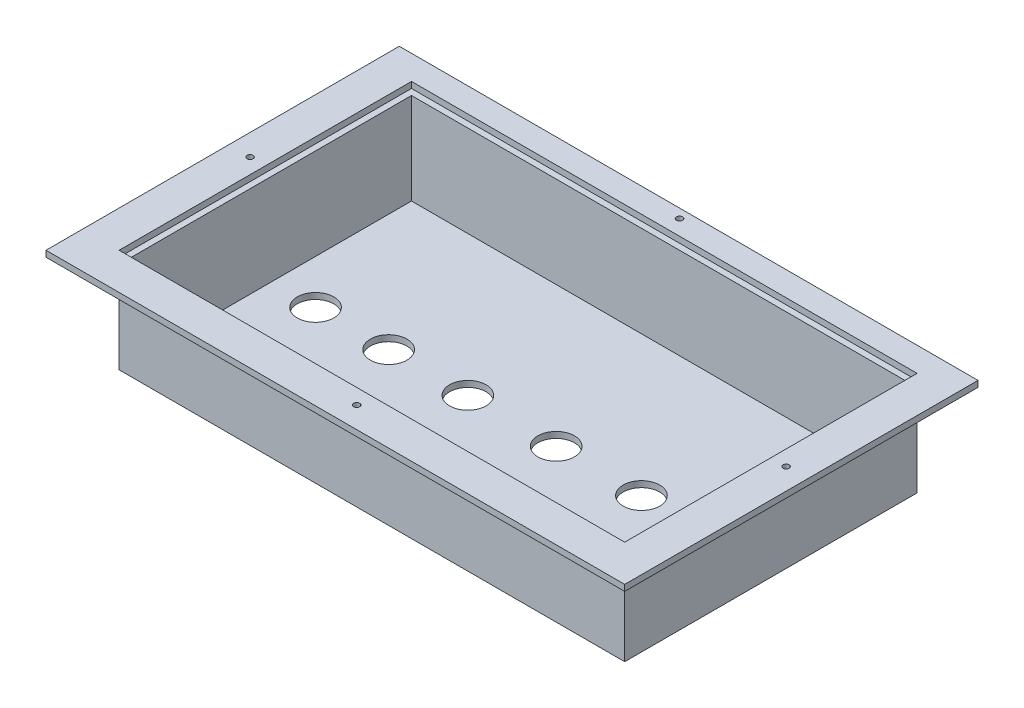
ISO-10303-21;
HEADER;
FILE_DESCRIPTION(('STEP AP214'),'2;1');
FILE_NAME('part.step','',(''),(''),'','','');
FILE_SCHEMA(('AUTOMOTIVE_DESIGN { 1 0 10303 214 1 1 1 1 }'));
ENDSEC;
DATA;
#1=APPLICATION_CONTEXT('core data for automotive mechanical design processes');
#2=APPLICATION_PROTOCOL_DEFINITION('international standard','automotive_design',2000,#1);
#3=PRODUCT_CONTEXT('',#1,'mechanical');
#4=PRODUCT('Part','Part','',(#3));
#5=PRODUCT_RELATED_PRODUCT_CATEGORY('part','',(#4));
#6=PRODUCT_DEFINITION_FORMATION('','',#4);
#7=PRODUCT_DEFINITION_CONTEXT('part definition',#1,'design');
#8=PRODUCT_DEFINITION('design','',#6,#7);
#9=PRODUCT_DEFINITION_SHAPE('','',#8);
#10=(LENGTH_UNIT() NAMED_UNIT(*) SI_UNIT(.MILLI.,.METRE.));
#11=(NAMED_UNIT(*) PLANE_ANGLE_UNIT() SI_UNIT($,.RADIAN.));
#12=(NAMED_UNIT(*) SI_UNIT($,.STERADIAN.) SOLID_ANGLE_UNIT());
#13=UNCERTAINTY_MEASURE_WITH_UNIT(LENGTH_MEASURE(1.E-05),#10,'distance_accuracy_value','');
#14=(GEOMETRIC_REPRESENTATION_CONTEXT(3) GLOBAL_UNCERTAINTY_ASSIGNED_CONTEXT((#13)) GLOBAL_UNIT_ASSIGNED_CONTEXT((#10,
#11,#12)) REPRESENTATION_CONTEXT('',''));
#15=CARTESIAN_POINT('',(0.,0.,0.));
#16=DIRECTION('',(0.,0.,1.));
#17=DIRECTION('',(1.,0.,0.));
#18=AXIS2_PLACEMENT_3D('',#15,#16,#17);
#19=CARTESIAN_POINT('',(83.,34.,0.));
#20=DIRECTION('',(-1.,0.,0.));
#21=DIRECTION('',(0.,0.,1.));
#22=AXIS2_PLACEMENT_3D('',#19,#20,#21);
#23=PLANE('',#22);
#24=DIRECTION('',(0.,0.,-1.));
#25=VECTOR('',#24,1.);
#26=CARTESIAN_POINT('',(83.,32.,0.));
#27=LINE('',#26,#25);
#28=CARTESIAN_POINT('',(83.,32.,48.));
#29=VERTEX_POINT('',#28);
#30=CARTESIAN_POINT('',(83.,32.,-48.));
#31=VERTEX_POINT('',#30);
#32=EDGE_CURVE('E286',#29,#31,#27,.T.);
#33=ORIENTED_EDGE('',*,*,#32,.F.);
#34=DIRECTION('',(0.,-1.,0.));
#35=VECTOR('',#34,1.);
#36=CARTESIAN_POINT('',(83.,34.,48.));
#37=LINE('',#36,#35);
#38=CARTESIAN_POINT('',(83.,34.,48.));
#39=VERTEX_POINT('',#38);
#40=EDGE_CURVE('E13',#39,#29,#37,.T.);
#41=ORIENTED_EDGE('',*,*,#40,.F.);
#42=DIRECTION('',(0.,0.,-1.));
#43=VECTOR('',#42,1.);
#44=CARTESIAN_POINT('',(83.,34.,0.));
#45=LINE('',#44,#43);
#46=CARTESIAN_POINT('',(83.,34.,-48.));
#47=VERTEX_POINT('',#46);
#48=EDGE_CURVE('E253',#39,#47,#45,.T.);
#49=ORIENTED_EDGE('',*,*,#48,.T.);
#50=DIRECTION('',(0.,-1.,0.));
#51=VECTOR('',#50,1.);
#52=CARTESIAN_POINT('',(83.,34.,-48.));
#53=LINE('',#52,#51);
#54=EDGE_CURVE('E185',#47,#31,#53,.T.);
#55=ORIENTED_EDGE('',*,*,#54,.T.);
#56=EDGE_LOOP('',(#33,#41,#49,#55));
#57=FACE_BOUND('',#56,.T.);
#58=ADVANCED_FACE('F166',(#57),#23,.T.);
#59=CARTESIAN_POINT('',(0.,34.,48.));
#60=DIRECTION('',(0.,0.,-1.));
#61=DIRECTION('',(-1.,0.,0.));
#62=AXIS2_PLACEMENT_3D('',#59,#60,#61);
#63=PLANE('',#62);
#64=DIRECTION('',(1.,0.,0.));
#65=VECTOR('',#64,1.);
#66=CARTESIAN_POINT('',(0.,32.,48.));
#67=LINE('',#66,#65);
#68=CARTESIAN_POINT('',(-83.,32.,48.));
#69=VERTEX_POINT('',#68);
#70=EDGE_CURVE('E242',#69,#29,#67,.T.);
#71=ORIENTED_EDGE('',*,*,#70,.F.);
#72=DIRECTION('',(0.,-1.,0.));
#73=VECTOR('',#72,1.);
#74=CARTESIAN_POINT('',(-83.,34.,48.));
#75=LINE('',#74,#73);
#76=CARTESIAN_POINT('',(-83.,34.,48.));
#77=VERTEX_POINT('',#76);
#78=EDGE_CURVE('E176',#77,#69,#75,.T.);
#79=ORIENTED_EDGE('',*,*,#78,.F.);
#80=DIRECTION('',(1.,0.,0.));
#81=VECTOR('',#80,1.);
#82=CARTESIAN_POINT('',(0.,34.,48.));
#83=LINE('',#82,#81);
#84=EDGE_CURVE('E240',#77,#39,#83,.T.);
#85=ORIENTED_EDGE('',*,*,#84,.T.);
#86=ORIENTED_EDGE('',*,*,#40,.T.);
#87=EDGE_LOOP('',(#71,#79,#85,#86));
#88=FACE_BOUND('',#87,.T.);
#89=ADVANCED_FACE('F239',(#88),#63,.T.);
#90=CARTESIAN_POINT('',(-83.,34.,0.));
#91=DIRECTION('',(1.,0.,0.));
#92=DIRECTION('',(0.,0.,-1.));
#93=AXIS2_PLACEMENT_3D('',#90,#91,#92);
#94=PLANE('',#93);
#95=DIRECTION('',(0.,0.,1.));
#96=VECTOR('',#95,1.);
#97=CARTESIAN_POINT('',(-83.,32.,0.));
#98=LINE('',#97,#96);
#99=CARTESIAN_POINT('',(-83.,32.,-48.));
#100=VERTEX_POINT('',#99);
#101=EDGE_CURVE('E289',#100,#69,#98,.T.);
#102=ORIENTED_EDGE('',*,*,#101,.F.);
#103=DIRECTION('',(0.,-1.,0.));
#104=VECTOR('',#103,1.);
#105=CARTESIAN_POINT('',(-83.,34.,-48.));
#106=LINE('',#105,#104);
#107=CARTESIAN_POINT('',(-83.,34.,-48.));
#108=VERTEX_POINT('',#107);
#109=EDGE_CURVE('E210',#108,#100,#106,.T.);
#110=ORIENTED_EDGE('',*,*,#109,.F.);
#111=DIRECTION('',(0.,0.,1.));
#112=VECTOR('',#111,1.);
#113=CARTESIAN_POINT('',(-83.,34.,0.));
#114=LINE('',#113,#112);
#115=EDGE_CURVE('E252',#108,#77,#114,.T.);
#116=ORIENTED_EDGE('',*,*,#115,.T.);
#117=ORIENTED_EDGE('',*,*,#78,.T.);
#118=EDGE_LOOP('',(#102,#110,#116,#117));
#119=FACE_BOUND('',#118,.T.);
#120=ADVANCED_FACE('F255',(#119),#94,.T.);
#121=CARTESIAN_POINT('',(95.,34.,0.));
#122=DIRECTION('',(1.,0.,0.));
#123=DIRECTION('',(0.,0.,-1.));
#124=AXIS2_PLACEMENT_3D('',#121,#122,#123);
#125=PLANE('',#124);
#126=DIRECTION('',(0.,0.,1.));
#127=VECTOR('',#126,1.);
#128=CARTESIAN_POINT('',(95.,32.,0.));
#129=LINE('',#128,#127);
#130=CARTESIAN_POINT('',(95.,32.,-56.));
#131=VERTEX_POINT('',#130);
#132=CARTESIAN_POINT('',(95.,32.,60.));
#133=VERTEX_POINT('',#132);
#134=EDGE_CURVE('E274',#131,#133,#129,.T.);
#135=ORIENTED_EDGE('',*,*,#134,.F.);
#136=DIRECTION('',(0.,-1.,0.));
#137=VECTOR('',#136,1.);
#138=CARTESIAN_POINT('',(95.,34.,-56.));
#139=LINE('',#138,#137);
#140=CARTESIAN_POINT('',(95.,34.,-56.));
#141=VERTEX_POINT('',#140);
#142=EDGE_CURVE('E170',#141,#131,#139,.T.);
#143=ORIENTED_EDGE('',*,*,#142,.F.);
#144=DIRECTION('',(0.,0.,1.));
#145=VECTOR('',#144,1.);
#146=CARTESIAN_POINT('',(95.,34.,0.));
#147=LINE('',#146,#145);
#148=CARTESIAN_POINT('',(95.,34.,60.));
#149=VERTEX_POINT('',#148);
#150=EDGE_CURVE('E325',#141,#149,#147,.T.);
#151=ORIENTED_EDGE('',*,*,#150,.T.);
#152=DIRECTION('',(0.,-1.,0.));
#153=VECTOR('',#152,1.);
#154=CARTESIAN_POINT('',(95.,34.,60.));
#155=LINE('',#154,#153);
#156=EDGE_CURVE('E258',#149,#133,#155,.T.);
#157=ORIENTED_EDGE('',*,*,#156,.T.);
#158=EDGE_LOOP('',(#135,#143,#151,#157));
#159=FACE_BOUND('',#158,.T.);
#160=ADVANCED_FACE('F310',(#159),#125,.T.);
#161=CARTESIAN_POINT('',(0.,34.,-56.));
#162=DIRECTION('',(0.,0.,-1.));
#163=DIRECTION('',(-1.,0.,0.));
#164=AXIS2_PLACEMENT_3D('',#161,#162,#163);
#165=PLANE('',#164);
#166=DIRECTION('',(1.,0.,0.));
#167=VECTOR('',#166,1.);
#168=CARTESIAN_POINT('',(0.,32.,-56.));
#169=LINE('',#168,#167);
#170=CARTESIAN_POINT('',(-95.,32.,-56.));
#171=VERTEX_POINT('',#170);
#172=EDGE_CURVE('E277',#171,#131,#169,.T.);
#173=ORIENTED_EDGE('',*,*,#172,.F.);
#174=DIRECTION('',(0.,-1.,0.));
#175=VECTOR('',#174,1.);
#176=CARTESIAN_POINT('',(-95.,34.,-56.));
#177=LINE('',#176,#175);
#178=CARTESIAN_POINT('',(-95.,34.,-56.));
#179=VERTEX_POINT('',#178);
#180=EDGE_CURVE('E300',#179,#171,#177,.T.);
#181=ORIENTED_EDGE('',*,*,#180,.F.);
#182=DIRECTION('',(1.,0.,0.));
#183=VECTOR('',#182,1.);
#184=CARTESIAN_POINT('',(0.,34.,-56.));
#185=LINE('',#184,#183);
#186=EDGE_CURVE('E309',#179,#141,#185,.T.);
#187=ORIENTED_EDGE('',*,*,#186,.T.);
#188=ORIENTED_EDGE('',*,*,#142,.T.);
#189=EDGE_LOOP('',(#173,#181,#187,#188));
#190=FACE_BOUND('',#189,.T.);
#191=ADVANCED_FACE('F307',(#190),#165,.T.);
#192=CARTESIAN_POINT('',(-95.,34.,0.));
#193=DIRECTION('',(1.,0.,0.));
#194=DIRECTION('',(0.,0.,-1.));
#195=AXIS2_PLACEMENT_3D('',#192,#193,#194);
#196=PLANE('',#195);
#197=DIRECTION('',(0.,0.,1.));
#198=VECTOR('',#197,1.);
#199=CARTESIAN_POINT('',(-95.,32.,0.));
#200=LINE('',#199,#198);
#201=CARTESIAN_POINT('',(-95.,32.,60.));
#202=VERTEX_POINT('',#201);
#203=EDGE_CURVE('E280',#171,#202,#200,.T.);
#204=ORIENTED_EDGE('',*,*,#203,.T.);
#205=DIRECTION('',(0.,-1.,0.));
#206=VECTOR('',#205,1.);
#207=CARTESIAN_POINT('',(-95.,34.,60.));
#208=LINE('',#207,#206);
#209=CARTESIAN_POINT('',(-95.,34.,60.));
#210=VERTEX_POINT('',#209);
#211=EDGE_CURVE('E298',#210,#202,#208,.T.);
#212=ORIENTED_EDGE('',*,*,#211,.F.);
#213=DIRECTION('',(0.,0.,1.));
#214=VECTOR('',#213,1.);
#215=CARTESIAN_POINT('',(-95.,34.,0.));
#216=LINE('',#215,#214);
#217=EDGE_CURVE('E318',#179,#210,#216,.T.);
#218=ORIENTED_EDGE('',*,*,#217,.F.);
#219=ORIENTED_EDGE('',*,*,#180,.T.);
#220=EDGE_LOOP('',(#204,#212,#218,#219));
#221=FACE_BOUND('',#220,.T.);
#222=ADVANCED_FACE('F316',(#221),#196,.F.);
#223=CARTESIAN_POINT('',(0.,34.,60.));
#224=DIRECTION('',(0.,0.,-1.));
#225=DIRECTION('',(-1.,0.,0.));
#226=AXIS2_PLACEMENT_3D('',#223,#224,#225);
#227=PLANE('',#226);
#228=DIRECTION('',(1.,0.,0.));
#229=VECTOR('',#228,1.);
#230=CARTESIAN_POINT('',(0.,32.,60.));
#231=LINE('',#230,#229);
#232=EDGE_CURVE('E283',#202,#133,#231,.T.);
#233=ORIENTED_EDGE('',*,*,#232,.T.);
#234=ORIENTED_EDGE('',*,*,#156,.F.);
#235=DIRECTION('',(1.,0.,0.));
#236=VECTOR('',#235,1.);
#237=CARTESIAN_POINT('',(0.,34.,60.));
#238=LINE('',#237,#236);
#239=EDGE_CURVE('E321',#210,#149,#238,.T.);
#240=ORIENTED_EDGE('',*,*,#239,.F.);
#241=ORIENTED_EDGE('',*,*,#211,.T.);
#242=EDGE_LOOP('',(#233,#234,#240,#241));
#243=FACE_BOUND('',#242,.T.);
#244=ADVANCED_FACE('F320',(#243),#227,.F.);
#245=CARTESIAN_POINT('',(0.,34.,53.));
#246=DIRECTION('',(0.,-1.,0.));
#247=DIRECTION('',(0.,0.,-1.));
#248=AXIS2_PLACEMENT_3D('',#245,#246,#247);
#249=CYLINDRICAL_SURFACE('',#248,1.);
#250=CARTESIAN_POINT('',(0.,34.,53.));
#251=DIRECTION('',(0.,1.,0.));
#252=DIRECTION('',(0.,0.,1.));
#253=AXIS2_PLACEMENT_3D('',#250,#251,#252);
#254=CIRCLE('',#253,1.);
#255=CARTESIAN_POINT('',(0.,34.,54.));
#256=VERTEX_POINT('',#255);
#257=EDGE_CURVE('E478',#256,#256,#254,.T.);
#258=ORIENTED_EDGE('',*,*,#257,.T.);
#259=EDGE_LOOP('',(#258));
#260=FACE_BOUND('',#259,.T.);
#261=CARTESIAN_POINT('',(0.,32.,53.));
#262=DIRECTION('',(0.,1.,0.));
#263=DIRECTION('',(0.,0.,1.));
#264=AXIS2_PLACEMENT_3D('',#261,#262,#263);
#265=CIRCLE('',#264,1.);
#266=CARTESIAN_POINT('',(0.,32.,54.));
#267=VERTEX_POINT('',#266);
#268=EDGE_CURVE('E271',#267,#267,#265,.T.);
#269=ORIENTED_EDGE('',*,*,#268,.F.);
#270=EDGE_LOOP('',(#269));
#271=FACE_BOUND('',#270,.T.);
#272=ADVANCED_FACE('F350',(#260,#271),#249,.F.);
#273=CARTESIAN_POINT('',(-88.,34.,0.));
#274=DIRECTION('',(0.,-1.,0.));
#275=DIRECTION('',(0.,0.,-1.));
#276=AXIS2_PLACEMENT_3D('',#273,#274,#275);
#277=CYLINDRICAL_SURFACE('',#276,0.999999999999998);
#278=CARTESIAN_POINT('',(-88.,34.,0.));
#279=DIRECTION('',(0.,1.,0.));
#280=DIRECTION('',(0.,0.,1.));
#281=AXIS2_PLACEMENT_3D('',#278,#279,#280);
#282=CIRCLE('',#281,0.999999999999998);
#283=CARTESIAN_POINT('',(-88.,34.,0.999999999999977));
#284=VERTEX_POINT('',#283);
#285=EDGE_CURVE('E475',#284,#284,#282,.T.);
#286=ORIENTED_EDGE('',*,*,#285,.T.);
#287=EDGE_LOOP('',(#286));
#288=FACE_BOUND('',#287,.T.);
#289=CARTESIAN_POINT('',(-88.,32.,0.));
#290=DIRECTION('',(0.,1.,0.));
#291=DIRECTION('',(0.,0.,1.));
#292=AXIS2_PLACEMENT_3D('',#289,#290,#291);
#293=CIRCLE('',#292,0.999999999999998);
#294=CARTESIAN_POINT('',(-88.,32.,0.999999999999977));
#295=VERTEX_POINT('',#294);
#296=EDGE_CURVE('E268',#295,#295,#293,.T.);
#297=ORIENTED_EDGE('',*,*,#296,.F.);
#298=EDGE_LOOP('',(#297));
#299=FACE_BOUND('',#298,.T.);
#300=ADVANCED_FACE('F359',(#288,#299),#277,.F.);
#301=CARTESIAN_POINT('',(0.,34.,-53.));
#302=DIRECTION('',(0.,-1.,0.));
#303=DIRECTION('',(0.,0.,-1.));
#304=AXIS2_PLACEMENT_3D('',#301,#302,#303);
#305=CYLINDRICAL_SURFACE('',#304,1.);
#306=CARTESIAN_POINT('',(0.,34.,-53.));
#307=DIRECTION('',(0.,1.,0.));
#308=DIRECTION('',(0.,0.,1.));
#309=AXIS2_PLACEMENT_3D('',#306,#307,#308);
#310=CIRCLE('',#309,1.);
#311=CARTESIAN_POINT('',(0.,34.,-52.));
#312=VERTEX_POINT('',#311);
#313=EDGE_CURVE('E370',#312,#312,#310,.T.);
#314=ORIENTED_EDGE('',*,*,#313,.T.);
#315=EDGE_LOOP('',(#314));
#316=FACE_BOUND('',#315,.T.);
#317=CARTESIAN_POINT('',(0.,32.,-53.));
#318=DIRECTION('',(0.,1.,0.));
#319=DIRECTION('',(0.,0.,1.));
#320=AXIS2_PLACEMENT_3D('',#317,#318,#319);
#321=CIRCLE('',#320,1.);
#322=CARTESIAN_POINT('',(0.,32.,-52.));
#323=VERTEX_POINT('',#322);
#324=EDGE_CURVE('E265',#323,#323,#321,.T.);
#325=ORIENTED_EDGE('',*,*,#324,.F.);
#326=EDGE_LOOP('',(#325));
#327=FACE_BOUND('',#326,.T.);
#328=ADVANCED_FACE('F337',(#316,#327),#305,.F.);
#329=CARTESIAN_POINT('',(88.,34.,0.));
#330=DIRECTION('',(0.,-1.,0.));
#331=DIRECTION('',(0.,0.,-1.));
#332=AXIS2_PLACEMENT_3D('',#329,#330,#331);
#333=CYLINDRICAL_SURFACE('',#332,0.999999999999998);
#334=CARTESIAN_POINT('',(88.,34.,0.));
#335=DIRECTION('',(0.,1.,0.));
#336=DIRECTION('',(0.,0.,1.));
#337=AXIS2_PLACEMENT_3D('',#334,#335,#336);
#338=CIRCLE('',#337,0.999999999999998);
#339=CARTESIAN_POINT('',(88.,34.,1.00000000000001));
#340=VERTEX_POINT('',#339);
#341=EDGE_CURVE('E294',#340,#340,#338,.T.);
#342=ORIENTED_EDGE('',*,*,#341,.T.);
#343=EDGE_LOOP('',(#342));
#344=FACE_BOUND('',#343,.T.);
#345=CARTESIAN_POINT('',(88.,32.,0.));
#346=DIRECTION('',(0.,1.,0.));
#347=DIRECTION('',(0.,0.,1.));
#348=AXIS2_PLACEMENT_3D('',#345,#346,#347);
#349=CIRCLE('',#348,0.999999999999998);
#350=CARTESIAN_POINT('',(88.,32.,1.00000000000001));
#351=VERTEX_POINT('',#350);
#352=EDGE_CURVE('E262',#351,#351,#349,.T.);
#353=ORIENTED_EDGE('',*,*,#352,.F.);
#354=EDGE_LOOP('',(#353));
#355=FACE_BOUND('',#354,.T.);
#356=ADVANCED_FACE('F168',(#344,#355),#333,.F.);
#357=CARTESIAN_POINT('',(0.,34.,-48.));
#358=DIRECTION('',(0.,0.,1.));
#359=DIRECTION('',(1.,0.,0.));
#360=AXIS2_PLACEMENT_3D('',#357,#358,#359);
#361=PLANE('',#360);
#362=DIRECTION('',(-1.,0.,0.));
#363=VECTOR('',#362,1.);
#364=CARTESIAN_POINT('',(0.,32.,-48.));
#365=LINE('',#364,#363);
#366=EDGE_CURVE('E291',#31,#100,#365,.T.);
#367=ORIENTED_EDGE('',*,*,#366,.F.);
#368=ORIENTED_EDGE('',*,*,#54,.F.);
#369=DIRECTION('',(-1.,0.,0.));
#370=VECTOR('',#369,1.);
#371=CARTESIAN_POINT('',(0.,34.,-48.));
#372=LINE('',#371,#370);
#373=EDGE_CURVE('E256',#47,#108,#372,.T.);
#374=ORIENTED_EDGE('',*,*,#373,.T.);
#375=ORIENTED_EDGE('',*,*,#109,.T.);
#376=EDGE_LOOP('',(#367,#368,#374,#375));
#377=FACE_BOUND('',#376,.T.);
#378=ADVANCED_FACE('F328',(#377),#361,.T.);
#379=CARTESIAN_POINT('',(0.,34.,0.));
#380=DIRECTION('',(0.,1.,0.));
#381=DIRECTION('',(0.,0.,1.));
#382=AXIS2_PLACEMENT_3D('',#379,#380,#381);
#383=PLANE('',#382);
#384=ORIENTED_EDGE('',*,*,#341,.F.);
#385=EDGE_LOOP('',(#384));
#386=FACE_BOUND('',#385,.T.);
#387=ORIENTED_EDGE('',*,*,#313,.F.);
#388=EDGE_LOOP('',(#387));
#389=FACE_BOUND('',#388,.T.);
#390=ORIENTED_EDGE('',*,*,#285,.F.);
#391=EDGE_LOOP('',(#390));
#392=FACE_BOUND('',#391,.T.);
#393=ORIENTED_EDGE('',*,*,#257,.F.);
#394=EDGE_LOOP('',(#393));
#395=FACE_BOUND('',#394,.T.);
#396=ORIENTED_EDGE('',*,*,#150,.F.);
#397=ORIENTED_EDGE('',*,*,#186,.F.);
#398=ORIENTED_EDGE('',*,*,#217,.T.);
#399=ORIENTED_EDGE('',*,*,#239,.T.);
#400=EDGE_LOOP('',(#396,#397,#398,#399));
#401=FACE_BOUND('',#400,.T.);
#402=ORIENTED_EDGE('',*,*,#48,.F.);
#403=ORIENTED_EDGE('',*,*,#84,.F.);
#404=ORIENTED_EDGE('',*,*,#115,.F.);
#405=ORIENTED_EDGE('',*,*,#373,.F.);
#406=EDGE_LOOP('',(#402,#403,#404,#405));
#407=FACE_BOUND('',#406,.T.);
#408=ADVANCED_FACE('F250',(#386,#389,#392,#395,#401,#407),#383,.T.);
#409=CARTESIAN_POINT('',(0.,32.,0.));
#410=DIRECTION('',(0.,1.,0.));
#411=DIRECTION('',(0.,0.,1.));
#412=AXIS2_PLACEMENT_3D('',#409,#410,#411);
#413=PLANE('',#412);
#414=ORIENTED_EDGE('',*,*,#352,.T.);
#415=EDGE_LOOP('',(#414));
#416=FACE_BOUND('',#415,.T.);
#417=ORIENTED_EDGE('',*,*,#324,.T.);
#418=EDGE_LOOP('',(#417));
#419=FACE_BOUND('',#418,.T.);
#420=ORIENTED_EDGE('',*,*,#296,.T.);
#421=EDGE_LOOP('',(#420));
#422=FACE_BOUND('',#421,.T.);
#423=ORIENTED_EDGE('',*,*,#268,.T.);
#424=EDGE_LOOP('',(#423));
#425=FACE_BOUND('',#424,.T.);
#426=ORIENTED_EDGE('',*,*,#134,.T.);
#427=ORIENTED_EDGE('',*,*,#232,.F.);
#428=ORIENTED_EDGE('',*,*,#203,.F.);
#429=ORIENTED_EDGE('',*,*,#172,.T.);
#430=EDGE_LOOP('',(#426,#427,#428,#429));
#431=FACE_BOUND('',#430,.T.);
#432=ORIENTED_EDGE('',*,*,#32,.T.);
#433=ORIENTED_EDGE('',*,*,#366,.T.);
#434=ORIENTED_EDGE('',*,*,#101,.T.);
#435=ORIENTED_EDGE('',*,*,#70,.T.);
#436=EDGE_LOOP('',(#432,#433,#434,#435));
#437=FACE_BOUND('',#436,.T.);
#438=ADVANCED_FACE('F313',(#416,#419,#422,#425,#431,#437),#413,.F.);
#439=CLOSED_SHELL('',(#58,#89,#120,#160,#191,#222,#244,#272,#300,#328,#356,#378,#408,#438));
#440=MANIFOLD_SOLID_BREP('B2',#439);
#441=CARTESIAN_POINT('',(0.,2.,0.));
#442=DIRECTION('',(0.,-1.,0.));
#443=DIRECTION('',(0.,0.,-1.));
#444=AXIS2_PLACEMENT_3D('',#441,#442,#443);
#445=PLANE('',#444);
#446=DIRECTION('',(1.,0.,0.));
#447=VECTOR('',#446,1.);
#448=CARTESIAN_POINT('',(-81.,2.,46.));
#449=LINE('',#448,#447);
#450=CARTESIAN_POINT('',(-81.,2.,46.));
#451=VERTEX_POINT('',#450);
#452=CARTESIAN_POINT('',(81.,2.,46.));
#453=VERTEX_POINT('',#452);
#454=EDGE_CURVE('E566',#451,#453,#449,.T.);
#455=ORIENTED_EDGE('',*,*,#454,.T.);
#456=DIRECTION('',(0.,0.,-1.));
#457=VECTOR('',#456,1.);
#458=CARTESIAN_POINT('',(81.,2.,-46.));
#459=LINE('',#458,#457);
#460=CARTESIAN_POINT('',(81.,2.,-46.));
#461=VERTEX_POINT('',#460);
#462=EDGE_CURVE('E585',#453,#461,#459,.T.);
#463=ORIENTED_EDGE('',*,*,#462,.T.);
#464=DIRECTION('',(-1.,0.,0.));
#465=VECTOR('',#464,1.);
#466=CARTESIAN_POINT('',(-81.,2.,-46.));
#467=LINE('',#466,#465);
#468=CARTESIAN_POINT('',(-81.,2.,-46.));
#469=VERTEX_POINT('',#468);
#470=EDGE_CURVE('E572',#461,#469,#467,.T.);
#471=ORIENTED_EDGE('',*,*,#470,.T.);
#472=DIRECTION('',(0.,0.,1.));
#473=VECTOR('',#472,1.);
#474=CARTESIAN_POINT('',(-81.,2.,-46.));
#475=LINE('',#474,#473);
#476=EDGE_CURVE('E588',#469,#451,#475,.T.);
#477=ORIENTED_EDGE('',*,*,#476,.T.);
#478=EDGE_LOOP('',(#455,#463,#471,#477));
#479=FACE_BOUND('',#478,.T.);
#480=CARTESIAN_POINT('',(-66.5,2.,0.));
#481=DIRECTION('',(0.,1.,0.));
#482=DIRECTION('',(0.,0.,1.));
#483=AXIS2_PLACEMENT_3D('',#480,#481,#482);
#484=CIRCLE('',#483,6.);
#485=CARTESIAN_POINT('',(-66.5,2.,6.));
#486=VERTEX_POINT('',#485);
#487=EDGE_CURVE('E651',#486,#486,#484,.T.);
#488=ORIENTED_EDGE('',*,*,#487,.F.);
#489=EDGE_LOOP('',(#488));
#490=FACE_BOUND('',#489,.T.);
#491=CARTESIAN_POINT('',(-42.5,2.,0.));
#492=DIRECTION('',(0.,1.,0.));
#493=DIRECTION('',(0.,0.,1.));
#494=AXIS2_PLACEMENT_3D('',#491,#492,#493);
#495=CIRCLE('',#494,6.);
#496=CARTESIAN_POINT('',(-42.5,2.,6.));
#497=VERTEX_POINT('',#496);
#498=EDGE_CURVE('E645',#497,#497,#495,.T.);
#499=ORIENTED_EDGE('',*,*,#498,.F.);
#500=EDGE_LOOP('',(#499));
#501=FACE_BOUND('',#500,.T.);
#502=CARTESIAN_POINT('',(-16.5,2.,0.));
#503=DIRECTION('',(0.,1.,0.));
#504=DIRECTION('',(0.,0.,1.));
#505=AXIS2_PLACEMENT_3D('',#502,#503,#504);
#506=CIRCLE('',#505,6.);
#507=CARTESIAN_POINT('',(-16.5,2.,6.));
#508=VERTEX_POINT('',#507);
#509=EDGE_CURVE('E639',#508,#508,#506,.T.);
#510=ORIENTED_EDGE('',*,*,#509,.F.);
#511=EDGE_LOOP('',(#510));
#512=FACE_BOUND('',#511,.T.);
#513=CARTESIAN_POINT('',(12.5,2.,0.));
#514=DIRECTION('',(0.,1.,0.));
#515=DIRECTION('',(0.,0.,1.));
#516=AXIS2_PLACEMENT_3D('',#513,#514,#515);
#517=CIRCLE('',#516,6.);
#518=CARTESIAN_POINT('',(12.5,2.,6.));
#519=VERTEX_POINT('',#518);
#520=EDGE_CURVE('E633',#519,#519,#517,.T.);
#521=ORIENTED_EDGE('',*,*,#520,.F.);
#522=EDGE_LOOP('',(#521));
#523=FACE_BOUND('',#522,.T.);
#524=CARTESIAN_POINT('',(40.5,2.,0.));
#525=DIRECTION('',(0.,1.,0.));
#526=DIRECTION('',(0.,0.,1.));
#527=AXIS2_PLACEMENT_3D('',#524,#525,#526);
#528=CIRCLE('',#527,6.);
#529=CARTESIAN_POINT('',(40.5,2.,6.));
#530=VERTEX_POINT('',#529);
#531=EDGE_CURVE('E627',#530,#530,#528,.T.);
#532=ORIENTED_EDGE('',*,*,#531,.F.);
#533=EDGE_LOOP('',(#532));
#534=FACE_BOUND('',#533,.T.);
#535=CARTESIAN_POINT('',(67.0042826552462,2.,8.44218415417558));
#536=DIRECTION('',(0.,1.,0.));
#537=DIRECTION('',(0.,0.,1.));
#538=AXIS2_PLACEMENT_3D('',#535,#536,#537);
#539=CIRCLE('',#538,4.5);
#540=CARTESIAN_POINT('',(67.0042826552462,2.,12.9421841541756));
#541=VERTEX_POINT('',#540);
#542=EDGE_CURVE('E621',#541,#541,#539,.T.);
#543=ORIENTED_EDGE('',*,*,#542,.F.);
#544=EDGE_LOOP('',(#543));
#545=FACE_BOUND('',#544,.T.);
#546=CARTESIAN_POINT('',(67.0042826552462,2.,-22.9699449870666));
#547=DIRECTION('',(0.,1.,0.));
#548=DIRECTION('',(0.,0.,1.));
#549=AXIS2_PLACEMENT_3D('',#546,#547,#548);
#550=CIRCLE('',#549,5.56383509604872);
#551=CARTESIAN_POINT('',(67.0042826552462,2.,-17.4061098910179));
#552=VERTEX_POINT('',#551);
#553=EDGE_CURVE('E615',#552,#552,#550,.T.);
#554=ORIENTED_EDGE('',*,*,#553,.F.);
#555=EDGE_LOOP('',(#554));
#556=FACE_BOUND('',#555,.T.);
#557=CARTESIAN_POINT('',(67.0042826552462,2.,-4.70985010706639));
#558=DIRECTION('',(0.,1.,0.));
#559=DIRECTION('',(0.,0.,1.));
#560=AXIS2_PLACEMENT_3D('',#557,#558,#559);
#561=CIRCLE('',#560,4.5);
#562=CARTESIAN_POINT('',(67.0042826552462,2.,-0.20985010706638));
#563=VERTEX_POINT('',#562);
#564=EDGE_CURVE('E609',#563,#563,#561,.T.);
#565=ORIENTED_EDGE('',*,*,#564,.F.);
#566=EDGE_LOOP('',(#565));
#567=FACE_BOUND('',#566,.T.);
#568=ADVANCED_FACE('F491',(#479,#490,#501,#512,#523,#534,#545,#556,#567),#445,.F.);
#569=CARTESIAN_POINT('',(0.,0.,0.));
#570=DIRECTION('',(0.,-1.,0.));
#571=DIRECTION('',(0.,0.,-1.));
#572=AXIS2_PLACEMENT_3D('',#569,#570,#571);
#573=PLANE('',#572);
#574=CARTESIAN_POINT('',(67.0042826552462,0.,-22.9699449870666));
#575=DIRECTION('',(0.,1.,0.));
#576=DIRECTION('',(0.,0.,1.));
#577=AXIS2_PLACEMENT_3D('',#574,#575,#576);
#578=CIRCLE('',#577,5.56383509604872);
#579=CARTESIAN_POINT('',(67.0042826552462,0.,-17.4061098910179));
#580=VERTEX_POINT('',#579);
#581=EDGE_CURVE('E612',#580,#580,#578,.T.);
#582=ORIENTED_EDGE('',*,*,#581,.T.);
#583=EDGE_LOOP('',(#582));
#584=FACE_BOUND('',#583,.T.);
#585=CARTESIAN_POINT('',(40.5,0.,0.));
#586=DIRECTION('',(0.,1.,0.));
#587=DIRECTION('',(0.,0.,1.));
#588=AXIS2_PLACEMENT_3D('',#585,#586,#587);
#589=CIRCLE('',#588,6.);
#590=CARTESIAN_POINT('',(40.5,0.,6.));
#591=VERTEX_POINT('',#590);
#592=EDGE_CURVE('E624',#591,#591,#589,.T.);
#593=ORIENTED_EDGE('',*,*,#592,.T.);
#594=EDGE_LOOP('',(#593));
#595=FACE_BOUND('',#594,.T.);
#596=CARTESIAN_POINT('',(-16.5,0.,0.));
#597=DIRECTION('',(0.,1.,0.));
#598=DIRECTION('',(0.,0.,1.));
#599=AXIS2_PLACEMENT_3D('',#596,#597,#598);
#600=CIRCLE('',#599,6.);
#601=CARTESIAN_POINT('',(-16.5,0.,6.));
#602=VERTEX_POINT('',#601);
#603=EDGE_CURVE('E636',#602,#602,#600,.T.);
#604=ORIENTED_EDGE('',*,*,#603,.T.);
#605=EDGE_LOOP('',(#604));
#606=FACE_BOUND('',#605,.T.);
#607=CARTESIAN_POINT('',(-66.5,0.,0.));
#608=DIRECTION('',(0.,1.,0.));
#609=DIRECTION('',(0.,0.,1.));
#610=AXIS2_PLACEMENT_3D('',#607,#608,#609);
#611=CIRCLE('',#610,6.);
#612=CARTESIAN_POINT('',(-66.5,0.,6.));
#613=VERTEX_POINT('',#612);
#614=EDGE_CURVE('E648',#613,#613,#611,.T.);
#615=ORIENTED_EDGE('',*,*,#614,.T.);
#616=EDGE_LOOP('',(#615));
#617=FACE_BOUND('',#616,.T.);
#618=DIRECTION('',(1.,0.,0.));
#619=VECTOR('',#618,1.);
#620=CARTESIAN_POINT('',(-83.,0.,-48.));
#621=LINE('',#620,#619);
#622=CARTESIAN_POINT('',(-83.,0.,-48.));
#623=VERTEX_POINT('',#622);
#624=CARTESIAN_POINT('',(83.,0.,-48.));
#625=VERTEX_POINT('',#624);
#626=EDGE_CURVE('E654',#623,#625,#621,.T.);
#627=ORIENTED_EDGE('',*,*,#626,.T.);
#628=DIRECTION('',(0.,0.,1.));
#629=VECTOR('',#628,1.);
#630=CARTESIAN_POINT('',(83.,0.,-48.));
#631=LINE('',#630,#629);
#632=CARTESIAN_POINT('',(83.,0.,48.));
#633=VERTEX_POINT('',#632);
#634=EDGE_CURVE('E659',#625,#633,#631,.T.);
#635=ORIENTED_EDGE('',*,*,#634,.T.);
#636=DIRECTION('',(1.,0.,0.));
#637=VECTOR('',#636,1.);
#638=CARTESIAN_POINT('',(-83.,0.,48.));
#639=LINE('',#638,#637);
#640=CARTESIAN_POINT('',(-83.,0.,48.));
#641=VERTEX_POINT('',#640);
#642=EDGE_CURVE('E662',#641,#633,#639,.T.);
#643=ORIENTED_EDGE('',*,*,#642,.F.);
#644=DIRECTION('',(0.,0.,1.));
#645=VECTOR('',#644,1.);
#646=CARTESIAN_POINT('',(-83.,0.,-48.));
#647=LINE('',#646,#645);
#648=EDGE_CURVE('E665',#623,#641,#647,.T.);
#649=ORIENTED_EDGE('',*,*,#648,.F.);
#650=EDGE_LOOP('',(#627,#635,#643,#649));
#651=FACE_BOUND('',#650,.T.);
#652=CARTESIAN_POINT('',(-42.5,0.,0.));
#653=DIRECTION('',(0.,1.,0.));
#654=DIRECTION('',(0.,0.,1.));
#655=AXIS2_PLACEMENT_3D('',#652,#653,#654);
#656=CIRCLE('',#655,6.);
#657=CARTESIAN_POINT('',(-42.5,0.,6.));
#658=VERTEX_POINT('',#657);
#659=EDGE_CURVE('E642',#658,#658,#656,.T.);
#660=ORIENTED_EDGE('',*,*,#659,.T.);
#661=EDGE_LOOP('',(#660));
#662=FACE_BOUND('',#661,.T.);
#663=CARTESIAN_POINT('',(12.5,0.,0.));
#664=DIRECTION('',(0.,1.,0.));
#665=DIRECTION('',(0.,0.,1.));
#666=AXIS2_PLACEMENT_3D('',#663,#664,#665);
#667=CIRCLE('',#666,6.);
#668=CARTESIAN_POINT('',(12.5,0.,6.));
#669=VERTEX_POINT('',#668);
#670=EDGE_CURVE('E630',#669,#669,#667,.T.);
#671=ORIENTED_EDGE('',*,*,#670,.T.);
#672=EDGE_LOOP('',(#671));
#673=FACE_BOUND('',#672,.T.);
#674=CARTESIAN_POINT('',(67.0042826552462,0.,8.44218415417558));
#675=DIRECTION('',(0.,1.,0.));
#676=DIRECTION('',(0.,0.,1.));
#677=AXIS2_PLACEMENT_3D('',#674,#675,#676);
#678=CIRCLE('',#677,4.5);
#679=CARTESIAN_POINT('',(67.0042826552462,0.,12.9421841541756));
#680=VERTEX_POINT('',#679);
#681=EDGE_CURVE('E618',#680,#680,#678,.T.);
#682=ORIENTED_EDGE('',*,*,#681,.T.);
#683=EDGE_LOOP('',(#682));
#684=FACE_BOUND('',#683,.T.);
#685=CARTESIAN_POINT('',(67.0042826552462,0.,-4.70985010706639));
#686=DIRECTION('',(0.,1.,0.));
#687=DIRECTION('',(0.,0.,1.));
#688=AXIS2_PLACEMENT_3D('',#685,#686,#687);
#689=CIRCLE('',#688,4.5);
#690=CARTESIAN_POINT('',(67.0042826552462,0.,-0.20985010706638));
#691=VERTEX_POINT('',#690);
#692=EDGE_CURVE('E608',#691,#691,#689,.T.);
#693=ORIENTED_EDGE('',*,*,#692,.T.);
#694=EDGE_LOOP('',(#693));
#695=FACE_BOUND('',#694,.T.);
#696=ADVANCED_FACE('F678',(#584,#595,#606,#617,#651,#662,#673,#684,#695),#573,.T.);
#697=CARTESIAN_POINT('',(-83.,2.,-48.));
#698=DIRECTION('',(0.,0.,-1.));
#699=DIRECTION('',(-1.,0.,0.));
#700=AXIS2_PLACEMENT_3D('',#697,#698,#699);
#701=PLANE('',#700);
#702=ORIENTED_EDGE('',*,*,#626,.F.);
#703=DIRECTION('',(0.,-1.,0.));
#704=VECTOR('',#703,1.);
#705=CARTESIAN_POINT('',(-83.,2.,-48.));
#706=LINE('',#705,#704);
#707=CARTESIAN_POINT('',(-83.,32.,-48.));
#708=VERTEX_POINT('',#707);
#709=EDGE_CURVE('E164',#708,#623,#706,.T.);
#710=ORIENTED_EDGE('',*,*,#709,.F.);
#711=DIRECTION('',(-1.,0.,0.));
#712=VECTOR('',#711,1.);
#713=CARTESIAN_POINT('',(-83.,32.,-48.));
#714=LINE('',#713,#712);
#715=CARTESIAN_POINT('',(83.,32.,-48.));
#716=VERTEX_POINT('',#715);
#717=EDGE_CURVE('E599',#716,#708,#714,.T.);
#718=ORIENTED_EDGE('',*,*,#717,.F.);
#719=DIRECTION('',(0.,-1.,0.));
#720=VECTOR('',#719,1.);
#721=CARTESIAN_POINT('',(83.,2.,-48.));
#722=LINE('',#721,#720);
#723=EDGE_CURVE('E495',#716,#625,#722,.T.);
#724=ORIENTED_EDGE('',*,*,#723,.T.);
#725=EDGE_LOOP('',(#702,#710,#718,#724));
#726=FACE_BOUND('',#725,.T.);
#727=ADVANCED_FACE('F493',(#726),#701,.T.);
#728=CARTESIAN_POINT('',(-83.,2.,-48.));
#729=DIRECTION('',(1.,0.,0.));
#730=DIRECTION('',(0.,0.,-1.));
#731=AXIS2_PLACEMENT_3D('',#728,#729,#730);
#732=PLANE('',#731);
#733=ORIENTED_EDGE('',*,*,#648,.T.);
#734=DIRECTION('',(0.,-1.,0.));
#735=VECTOR('',#734,1.);
#736=CARTESIAN_POINT('',(-83.,2.,48.));
#737=LINE('',#736,#735);
#738=CARTESIAN_POINT('',(-83.,32.,48.));
#739=VERTEX_POINT('',#738);
#740=EDGE_CURVE('E500',#739,#641,#737,.T.);
#741=ORIENTED_EDGE('',*,*,#740,.F.);
#742=DIRECTION('',(0.,0.,1.));
#743=VECTOR('',#742,1.);
#744=CARTESIAN_POINT('',(-83.,32.,-48.));
#745=LINE('',#744,#743);
#746=EDGE_CURVE('E602',#708,#739,#745,.T.);
#747=ORIENTED_EDGE('',*,*,#746,.F.);
#748=ORIENTED_EDGE('',*,*,#709,.T.);
#749=EDGE_LOOP('',(#733,#741,#747,#748));
#750=FACE_BOUND('',#749,.T.);
#751=ADVANCED_FACE('F680',(#750),#732,.F.);
#752=CARTESIAN_POINT('',(-83.,2.,48.));
#753=DIRECTION('',(0.,0.,-1.));
#754=DIRECTION('',(-1.,0.,0.));
#755=AXIS2_PLACEMENT_3D('',#752,#753,#754);
#756=PLANE('',#755);
#757=ORIENTED_EDGE('',*,*,#642,.T.);
#758=DIRECTION('',(0.,-1.,0.));
#759=VECTOR('',#758,1.);
#760=CARTESIAN_POINT('',(83.,2.,48.));
#761=LINE('',#760,#759);
#762=CARTESIAN_POINT('',(83.,32.,48.));
#763=VERTEX_POINT('',#762);
#764=EDGE_CURVE('E668',#763,#633,#761,.T.);
#765=ORIENTED_EDGE('',*,*,#764,.F.);
#766=DIRECTION('',(1.,0.,0.));
#767=VECTOR('',#766,1.);
#768=CARTESIAN_POINT('',(-83.,32.,48.));
#769=LINE('',#768,#767);
#770=EDGE_CURVE('E605',#739,#763,#769,.T.);
#771=ORIENTED_EDGE('',*,*,#770,.F.);
#772=ORIENTED_EDGE('',*,*,#740,.T.);
#773=EDGE_LOOP('',(#757,#765,#771,#772));
#774=FACE_BOUND('',#773,.T.);
#775=ADVANCED_FACE('F683',(#774),#756,.F.);
#776=CARTESIAN_POINT('',(83.,2.,-48.));
#777=DIRECTION('',(1.,0.,0.));
#778=DIRECTION('',(0.,0.,-1.));
#779=AXIS2_PLACEMENT_3D('',#776,#777,#778);
#780=PLANE('',#779);
#781=ORIENTED_EDGE('',*,*,#634,.F.);
#782=ORIENTED_EDGE('',*,*,#723,.F.);
#783=DIRECTION('',(0.,0.,-1.));
#784=VECTOR('',#783,1.);
#785=CARTESIAN_POINT('',(83.,32.,-48.));
#786=LINE('',#785,#784);
#787=EDGE_CURVE('E573',#763,#716,#786,.T.);
#788=ORIENTED_EDGE('',*,*,#787,.F.);
#789=ORIENTED_EDGE('',*,*,#764,.T.);
#790=EDGE_LOOP('',(#781,#782,#788,#789));
#791=FACE_BOUND('',#790,.T.);
#792=ADVANCED_FACE('F675',(#791),#780,.T.);
#793=CARTESIAN_POINT('',(-66.5,2.,0.));
#794=DIRECTION('',(0.,-1.,0.));
#795=DIRECTION('',(0.,0.,-1.));
#796=AXIS2_PLACEMENT_3D('',#793,#794,#795);
#797=CYLINDRICAL_SURFACE('',#796,6.);
#798=ORIENTED_EDGE('',*,*,#487,.T.);
#799=EDGE_LOOP('',(#798));
#800=FACE_BOUND('',#799,.T.);
#801=ORIENTED_EDGE('',*,*,#614,.F.);
#802=EDGE_LOOP('',(#801));
#803=FACE_BOUND('',#802,.T.);
#804=ADVANCED_FACE('F706',(#800,#803),#797,.F.);
#805=CARTESIAN_POINT('',(-42.5,2.,0.));
#806=DIRECTION('',(0.,-1.,0.));
#807=DIRECTION('',(0.,0.,-1.));
#808=AXIS2_PLACEMENT_3D('',#805,#806,#807);
#809=CYLINDRICAL_SURFACE('',#808,6.);
#810=ORIENTED_EDGE('',*,*,#498,.T.);
#811=EDGE_LOOP('',(#810));
#812=FACE_BOUND('',#811,.T.);
#813=ORIENTED_EDGE('',*,*,#659,.F.);
#814=EDGE_LOOP('',(#813));
#815=FACE_BOUND('',#814,.T.);
#816=ADVANCED_FACE('F716',(#812,#815),#809,.F.);
#817=CARTESIAN_POINT('',(-16.5,2.,0.));
#818=DIRECTION('',(0.,-1.,0.));
#819=DIRECTION('',(0.,0.,-1.));
#820=AXIS2_PLACEMENT_3D('',#817,#818,#819);
#821=CYLINDRICAL_SURFACE('',#820,6.);
#822=ORIENTED_EDGE('',*,*,#509,.T.);
#823=EDGE_LOOP('',(#822));
#824=FACE_BOUND('',#823,.T.);
#825=ORIENTED_EDGE('',*,*,#603,.F.);
#826=EDGE_LOOP('',(#825));
#827=FACE_BOUND('',#826,.T.);
#828=ADVANCED_FACE('F721',(#824,#827),#821,.F.);
#829=CARTESIAN_POINT('',(12.5,2.,0.));
#830=DIRECTION('',(0.,-1.,0.));
#831=DIRECTION('',(0.,0.,-1.));
#832=AXIS2_PLACEMENT_3D('',#829,#830,#831);
#833=CYLINDRICAL_SURFACE('',#832,6.);
#834=ORIENTED_EDGE('',*,*,#520,.T.);
#835=EDGE_LOOP('',(#834));
#836=FACE_BOUND('',#835,.T.);
#837=ORIENTED_EDGE('',*,*,#670,.F.);
#838=EDGE_LOOP('',(#837));
#839=FACE_BOUND('',#838,.T.);
#840=ADVANCED_FACE('F756',(#836,#839),#833,.F.);
#841=CARTESIAN_POINT('',(40.5,2.,0.));
#842=DIRECTION('',(0.,-1.,0.));
#843=DIRECTION('',(0.,0.,-1.));
#844=AXIS2_PLACEMENT_3D('',#841,#842,#843);
#845=CYLINDRICAL_SURFACE('',#844,6.);
#846=ORIENTED_EDGE('',*,*,#531,.T.);
#847=EDGE_LOOP('',(#846));
#848=FACE_BOUND('',#847,.T.);
#849=ORIENTED_EDGE('',*,*,#592,.F.);
#850=EDGE_LOOP('',(#849));
#851=FACE_BOUND('',#850,.T.);
#852=ADVANCED_FACE('F762',(#848,#851),#845,.F.);
#853=CARTESIAN_POINT('',(67.0042826552462,2.,8.44218415417558));
#854=DIRECTION('',(0.,-1.,0.));
#855=DIRECTION('',(0.,0.,-1.));
#856=AXIS2_PLACEMENT_3D('',#853,#854,#855);
#857=CYLINDRICAL_SURFACE('',#856,4.5);
#858=ORIENTED_EDGE('',*,*,#542,.T.);
#859=EDGE_LOOP('',(#858));
#860=FACE_BOUND('',#859,.T.);
#861=ORIENTED_EDGE('',*,*,#681,.F.);
#862=EDGE_LOOP('',(#861));
#863=FACE_BOUND('',#862,.T.);
#864=ADVANCED_FACE('F747',(#860,#863),#857,.F.);
#865=CARTESIAN_POINT('',(67.0042826552462,2.,-22.9699449870666));
#866=DIRECTION('',(0.,-1.,0.));
#867=DIRECTION('',(0.,0.,-1.));
#868=AXIS2_PLACEMENT_3D('',#865,#866,#867);
#869=CYLINDRICAL_SURFACE('',#868,5.56383509604872);
#870=ORIENTED_EDGE('',*,*,#553,.T.);
#871=EDGE_LOOP('',(#870));
#872=FACE_BOUND('',#871,.T.);
#873=ORIENTED_EDGE('',*,*,#581,.F.);
#874=EDGE_LOOP('',(#873));
#875=FACE_BOUND('',#874,.T.);
#876=ADVANCED_FACE('F693',(#872,#875),#869,.F.);
#877=CARTESIAN_POINT('',(67.0042826552462,2.,-4.70985010706639));
#878=DIRECTION('',(0.,-1.,0.));
#879=DIRECTION('',(0.,0.,-1.));
#880=AXIS2_PLACEMENT_3D('',#877,#878,#879);
#881=CYLINDRICAL_SURFACE('',#880,4.5);
#882=ORIENTED_EDGE('',*,*,#564,.T.);
#883=EDGE_LOOP('',(#882));
#884=FACE_BOUND('',#883,.T.);
#885=ORIENTED_EDGE('',*,*,#692,.F.);
#886=EDGE_LOOP('',(#885));
#887=FACE_BOUND('',#886,.T.);
#888=ADVANCED_FACE('F686',(#884,#887),#881,.F.);
#889=CARTESIAN_POINT('',(0.,32.,0.));
#890=DIRECTION('',(0.,1.,0.));
#891=DIRECTION('',(0.,0.,1.));
#892=AXIS2_PLACEMENT_3D('',#889,#890,#891);
#893=PLANE('',#892);
#894=ORIENTED_EDGE('',*,*,#787,.T.);
#895=ORIENTED_EDGE('',*,*,#717,.T.);
#896=ORIENTED_EDGE('',*,*,#746,.T.);
#897=ORIENTED_EDGE('',*,*,#770,.T.);
#898=EDGE_LOOP('',(#894,#895,#896,#897));
#899=FACE_BOUND('',#898,.T.);
#900=DIRECTION('',(-1.,0.,0.));
#901=VECTOR('',#900,1.);
#902=CARTESIAN_POINT('',(-81.,32.,-46.));
#903=LINE('',#902,#901);
#904=CARTESIAN_POINT('',(81.,32.,-46.));
#905=VERTEX_POINT('',#904);
#906=CARTESIAN_POINT('',(-81.,32.,-46.));
#907=VERTEX_POINT('',#906);
#908=EDGE_CURVE('E565',#905,#907,#903,.T.);
#909=ORIENTED_EDGE('',*,*,#908,.F.);
#910=DIRECTION('',(0.,0.,-1.));
#911=VECTOR('',#910,1.);
#912=CARTESIAN_POINT('',(81.,32.,-46.));
#913=LINE('',#912,#911);
#914=CARTESIAN_POINT('',(81.,32.,46.));
#915=VERTEX_POINT('',#914);
#916=EDGE_CURVE('E557',#915,#905,#913,.T.);
#917=ORIENTED_EDGE('',*,*,#916,.F.);
#918=DIRECTION('',(1.,0.,0.));
#919=VECTOR('',#918,1.);
#920=CARTESIAN_POINT('',(-81.,32.,46.));
#921=LINE('',#920,#919);
#922=CARTESIAN_POINT('',(-81.,32.,46.));
#923=VERTEX_POINT('',#922);
#924=EDGE_CURVE('E581',#923,#915,#921,.T.);
#925=ORIENTED_EDGE('',*,*,#924,.F.);
#926=DIRECTION('',(0.,0.,1.));
#927=VECTOR('',#926,1.);
#928=CARTESIAN_POINT('',(-81.,32.,-46.));
#929=LINE('',#928,#927);
#930=EDGE_CURVE('E579',#907,#923,#929,.T.);
#931=ORIENTED_EDGE('',*,*,#930,.F.);
#932=EDGE_LOOP('',(#909,#917,#925,#931));
#933=FACE_BOUND('',#932,.T.);
#934=ADVANCED_FACE('F577',(#899,#933),#893,.T.);
#935=CARTESIAN_POINT('',(81.,32.,-46.));
#936=DIRECTION('',(-1.,0.,0.));
#937=DIRECTION('',(0.,0.,1.));
#938=AXIS2_PLACEMENT_3D('',#935,#936,#937);
#939=PLANE('',#938);
#940=ORIENTED_EDGE('',*,*,#462,.F.);
#941=DIRECTION('',(0.,-1.,0.));
#942=VECTOR('',#941,1.);
#943=CARTESIAN_POINT('',(81.,32.,46.));
#944=LINE('',#943,#942);
#945=EDGE_CURVE('E508',#915,#453,#944,.T.);
#946=ORIENTED_EDGE('',*,*,#945,.F.);
#947=ORIENTED_EDGE('',*,*,#916,.T.);
#948=DIRECTION('',(0.,-1.,0.));
#949=VECTOR('',#948,1.);
#950=CARTESIAN_POINT('',(81.,32.,-46.));
#951=LINE('',#950,#949);
#952=EDGE_CURVE('E560',#905,#461,#951,.T.);
#953=ORIENTED_EDGE('',*,*,#952,.T.);
#954=EDGE_LOOP('',(#940,#946,#947,#953));
#955=FACE_BOUND('',#954,.T.);
#956=ADVANCED_FACE('F559',(#955),#939,.T.);
#957=CARTESIAN_POINT('',(-81.,32.,-46.));
#958=DIRECTION('',(0.,0.,1.));
#959=DIRECTION('',(1.,0.,0.));
#960=AXIS2_PLACEMENT_3D('',#957,#958,#959);
#961=PLANE('',#960);
#962=ORIENTED_EDGE('',*,*,#470,.F.);
#963=ORIENTED_EDGE('',*,*,#952,.F.);
#964=ORIENTED_EDGE('',*,*,#908,.T.);
#965=DIRECTION('',(0.,-1.,0.));
#966=VECTOR('',#965,1.);
#967=CARTESIAN_POINT('',(-81.,32.,-46.));
#968=LINE('',#967,#966);
#969=EDGE_CURVE('E574',#907,#469,#968,.T.);
#970=ORIENTED_EDGE('',*,*,#969,.T.);
#971=EDGE_LOOP('',(#962,#963,#964,#970));
#972=FACE_BOUND('',#971,.T.);
#973=ADVANCED_FACE('F569',(#972),#961,.T.);
#974=CARTESIAN_POINT('',(-81.,32.,-46.));
#975=DIRECTION('',(1.,0.,0.));
#976=DIRECTION('',(0.,0.,-1.));
#977=AXIS2_PLACEMENT_3D('',#974,#975,#976);
#978=PLANE('',#977);
#979=ORIENTED_EDGE('',*,*,#476,.F.);
#980=ORIENTED_EDGE('',*,*,#969,.F.);
#981=ORIENTED_EDGE('',*,*,#930,.T.);
#982=DIRECTION('',(0.,-1.,0.));
#983=VECTOR('',#982,1.);
#984=CARTESIAN_POINT('',(-81.,32.,46.));
#985=LINE('',#984,#983);
#986=EDGE_CURVE('E594',#923,#451,#985,.T.);
#987=ORIENTED_EDGE('',*,*,#986,.T.);
#988=EDGE_LOOP('',(#979,#980,#981,#987));
#989=FACE_BOUND('',#988,.T.);
#990=ADVANCED_FACE('F838',(#989),#978,.T.);
#991=CARTESIAN_POINT('',(-81.,32.,46.));
#992=DIRECTION('',(0.,0.,-1.));
#993=DIRECTION('',(-1.,0.,0.));
#994=AXIS2_PLACEMENT_3D('',#991,#992,#993);
#995=PLANE('',#994);
#996=ORIENTED_EDGE('',*,*,#454,.F.);
#997=ORIENTED_EDGE('',*,*,#986,.F.);
#998=ORIENTED_EDGE('',*,*,#924,.T.);
#999=ORIENTED_EDGE('',*,*,#945,.T.);
#1000=EDGE_LOOP('',(#996,#997,#998,#999));
#1001=FACE_BOUND('',#1000,.T.);
#1002=ADVANCED_FACE('F847',(#1001),#995,.T.);
#1003=CLOSED_SHELL('',(#568,#696,#727,#751,#775,#792,#804,#816,#828,#840,#852,#864,#876,#888,
#934,#956,#973,#990,#1002));
#1004=MANIFOLD_SOLID_BREP('B7',#1003);
#1005=ADVANCED_BREP_SHAPE_REPRESENTATION('',(#18,#440,#1004),#14);
#1006=SHAPE_DEFINITION_REPRESENTATION(#9,#1005);
ENDSEC;
END-ISO-10303-21;
